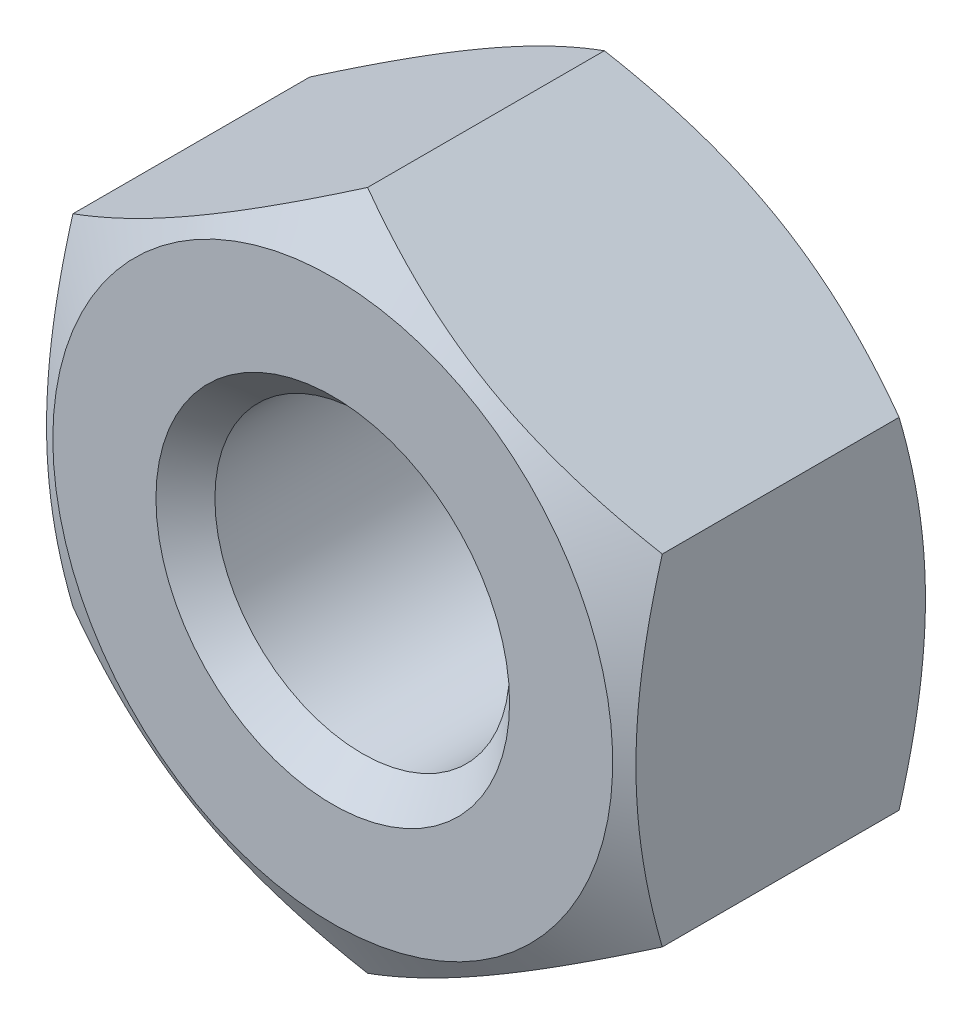
ISO-10303-21;
HEADER;
FILE_DESCRIPTION(('STEP AP214'),'2;1');
FILE_NAME('part.step','',(''),(''),'','','');
FILE_SCHEMA(('AUTOMOTIVE_DESIGN { 1 0 10303 214 1 1 1 1 }'));
ENDSEC;
DATA;
#1=APPLICATION_CONTEXT('core data for automotive mechanical design processes');
#2=APPLICATION_PROTOCOL_DEFINITION('international standard','automotive_design',2000,#1);
#3=PRODUCT_CONTEXT('',#1,'mechanical');
#4=PRODUCT('Part','Part','',(#3));
#5=PRODUCT_RELATED_PRODUCT_CATEGORY('part','',(#4));
#6=PRODUCT_DEFINITION_FORMATION('','',#4);
#7=PRODUCT_DEFINITION_CONTEXT('part definition',#1,'design');
#8=PRODUCT_DEFINITION('design','',#6,#7);
#9=PRODUCT_DEFINITION_SHAPE('','',#8);
#10=(LENGTH_UNIT() NAMED_UNIT(*) SI_UNIT(.MILLI.,.METRE.));
#11=(NAMED_UNIT(*) PLANE_ANGLE_UNIT() SI_UNIT($,.RADIAN.));
#12=(NAMED_UNIT(*) SI_UNIT($,.STERADIAN.) SOLID_ANGLE_UNIT());
#13=UNCERTAINTY_MEASURE_WITH_UNIT(LENGTH_MEASURE(1.E-05),#10,'distance_accuracy_value','');
#14=(GEOMETRIC_REPRESENTATION_CONTEXT(3) GLOBAL_UNCERTAINTY_ASSIGNED_CONTEXT((#13)) GLOBAL_UNIT_ASSIGNED_CONTEXT((#10,
#11,#12)) REPRESENTATION_CONTEXT('',''));
#15=CARTESIAN_POINT('',(0.,0.,0.));
#16=DIRECTION('',(0.,0.,1.));
#17=DIRECTION('',(1.,0.,0.));
#18=AXIS2_PLACEMENT_3D('',#15,#16,#17);
#19=CARTESIAN_POINT('',(0.,0.,0.));
#20=DIRECTION('',(0.,0.,1.));
#21=DIRECTION('',(1.,0.,0.));
#22=AXIS2_PLACEMENT_3D('',#19,#20,#21);
#23=PLANE('',#22);
#24=CARTESIAN_POINT('',(0.,0.,0.));
#25=DIRECTION('',(0.,0.,1.));
#26=DIRECTION('',(1.,0.,0.));
#27=AXIS2_PLACEMENT_3D('',#24,#25,#26);
#28=CIRCLE('',#27,3.);
#29=CARTESIAN_POINT('',(3.,0.,0.));
#30=VERTEX_POINT('',#29);
#31=EDGE_CURVE('E11',#30,#30,#28,.T.);
#32=ORIENTED_EDGE('',*,*,#31,.T.);
#33=EDGE_LOOP('',(#32));
#34=FACE_BOUND('',#33,.T.);
#35=CARTESIAN_POINT('',(0.,0.,0.));
#36=DIRECTION('',(0.,0.,-1.));
#37=DIRECTION('',(-1.,0.,0.));
#38=AXIS2_PLACEMENT_3D('',#35,#36,#37);
#39=CIRCLE('',#38,4.74999999999995);
#40=CARTESIAN_POINT('',(-4.74999999999995,0.,0.));
#41=VERTEX_POINT('',#40);
#42=EDGE_CURVE('E260',#41,#41,#39,.T.);
#43=ORIENTED_EDGE('',*,*,#42,.T.);
#44=EDGE_LOOP('',(#43));
#45=FACE_BOUND('',#44,.T.);
#46=ADVANCED_FACE('F46',(#34,#45),#23,.F.);
#47=CARTESIAN_POINT('',(0.,0.,5.2));
#48=DIRECTION('',(0.,0.,1.));
#49=DIRECTION('',(1.,0.,0.));
#50=AXIS2_PLACEMENT_3D('',#47,#48,#49);
#51=PLANE('',#50);
#52=CARTESIAN_POINT('',(0.,0.,5.2));
#53=DIRECTION('',(0.,0.,1.));
#54=DIRECTION('',(1.,0.,0.));
#55=AXIS2_PLACEMENT_3D('',#52,#53,#54);
#56=CIRCLE('',#55,3.);
#57=CARTESIAN_POINT('',(3.,0.,5.2));
#58=VERTEX_POINT('',#57);
#59=EDGE_CURVE('E55',#58,#58,#56,.F.);
#60=ORIENTED_EDGE('',*,*,#59,.T.);
#61=EDGE_LOOP('',(#60));
#62=FACE_BOUND('',#61,.T.);
#63=CARTESIAN_POINT('',(0.,0.,5.2));
#64=DIRECTION('',(0.,0.,-1.));
#65=DIRECTION('',(-1.,0.,0.));
#66=AXIS2_PLACEMENT_3D('',#63,#64,#65);
#67=CIRCLE('',#66,4.74999999999995);
#68=CARTESIAN_POINT('',(-4.74999999999995,0.,5.2));
#69=VERTEX_POINT('',#68);
#70=EDGE_CURVE('E262',#69,#69,#67,.T.);
#71=ORIENTED_EDGE('',*,*,#70,.F.);
#72=EDGE_LOOP('',(#71));
#73=FACE_BOUND('',#72,.T.);
#74=ADVANCED_FACE('F250',(#62,#73),#51,.T.);
#75=CARTESIAN_POINT('',(0.,0.,5.2));
#76=DIRECTION('',(0.,0.,-1.));
#77=DIRECTION('',(-1.,0.,0.));
#78=AXIS2_PLACEMENT_3D('',#75,#76,#77);
#79=CYLINDRICAL_SURFACE('',#78,2.5);
#80=CARTESIAN_POINT('',(0.,0.,4.7));
#81=DIRECTION('',(0.,0.,1.));
#82=DIRECTION('',(1.,0.,0.));
#83=AXIS2_PLACEMENT_3D('',#80,#81,#82);
#84=CIRCLE('',#83,2.5);
#85=CARTESIAN_POINT('',(2.5,0.,4.7));
#86=VERTEX_POINT('',#85);
#87=EDGE_CURVE('E271',#86,#86,#84,.T.);
#88=ORIENTED_EDGE('',*,*,#87,.T.);
#89=EDGE_LOOP('',(#88));
#90=FACE_BOUND('',#89,.T.);
#91=CARTESIAN_POINT('',(0.,0.,0.500000000000006));
#92=DIRECTION('',(0.,0.,1.));
#93=DIRECTION('',(1.,0.,0.));
#94=AXIS2_PLACEMENT_3D('',#91,#92,#93);
#95=CIRCLE('',#94,2.5);
#96=CARTESIAN_POINT('',(2.5,0.,0.500000000000006));
#97=VERTEX_POINT('',#96);
#98=EDGE_CURVE('E269',#97,#97,#95,.F.);
#99=ORIENTED_EDGE('',*,*,#98,.T.);
#100=EDGE_LOOP('',(#99));
#101=FACE_BOUND('',#100,.T.);
#102=ADVANCED_FACE('F153',(#90,#101),#79,.F.);
#103=CARTESIAN_POINT('',(0.,0.,5.2));
#104=DIRECTION('',(0.,0.,-1.));
#105=DIRECTION('',(-1.,0.,0.));
#106=AXIS2_PLACEMENT_3D('',#103,#104,#105);
#107=CONICAL_SURFACE('',#106,4.74999999999995,1.0471975511966);
#108=ORIENTED_EDGE('',*,*,#70,.T.);
#109=EDGE_LOOP('',(#108));
#110=FACE_BOUND('',#109,.T.);
#111=CARTESIAN_POINT('',(-5.00020000000001,2.88663587589428,4.60901377665075));
#112=CARTESIAN_POINT('',(-4.78046540547483,3.01349970319367,4.68227586506495));
#113=CARTESIAN_POINT('',(-4.55885141554043,3.14144859993848,4.74891111078449));
#114=CARTESIAN_POINT('',(-4.1117860045465,3.3995619353212,4.86522344169177));
#115=CARTESIAN_POINT('',(-3.88632664040924,3.52973095989717,4.91485938278679));
#116=CARTESIAN_POINT('',(-3.43816769477651,3.78847564779796,4.99211140728389));
#117=CARTESIAN_POINT('',(-3.21553790689583,3.91701101576051,5.0202420544191));
#118=CARTESIAN_POINT('',(-2.88081009815338,4.11026620624321,5.0454675107489));
#119=CARTESIAN_POINT('',(-2.76915780319496,4.17472868879309,5.05104897293311));
#120=CARTESIAN_POINT('',(-2.54575002932623,4.30371322717526,5.05646021595112));
#121=CARTESIAN_POINT('',(-2.43399455370971,4.36823528110587,5.05629017444439));
#122=CARTESIAN_POINT('',(-2.12781576914939,4.54500768479193,5.04790880091056));
#123=CARTESIAN_POINT('',(-1.93349391403281,4.65719946015292,5.03383266080534));
#124=CARTESIAN_POINT('',(-1.54613989800231,4.88083840557981,4.98919717559316));
#125=CARTESIAN_POINT('',(-1.35310909862844,4.9922847895602,4.95862257255509));
#126=CARTESIAN_POINT('',(-0.964974657525157,5.21637431361295,4.88219393908143));
#127=CARTESIAN_POINT('',(-0.769920001358273,5.32898917185759,4.83601605382392));
#128=CARTESIAN_POINT('',(-0.382719654641236,5.55253939626498,4.73121063821066));
#129=CARTESIAN_POINT('',(-0.190569004591916,5.66347762579592,4.67260772926522));
#130=CARTESIAN_POINT('',(0.000199999999999706,5.7736181619501,4.60901377665077));
#131=B_SPLINE_CURVE_WITH_KNOTS('',3,(#111,#112,#113,#114,#115,#116,#117,#118,#119,#120,#121,
#122,#123,#124,#125,#126,#127,#128,#129,#130),.UNSPECIFIED.,.F.,.F.,(4,2,2,2,2,2,2,2,2,4),(0.,
0.792555841363088,1.58701660053333,2.36181537487279,2.74884076077324,3.13585419177293,
3.80962362599678,4.48401723901189,5.17336882348929,5.86136694793727),.UNSPECIFIED.);
#132=CARTESIAN_POINT('',(-5.00000000000001,2.88675134594807,4.60908044531739));
#133=VERTEX_POINT('',#132);
#134=CARTESIAN_POINT('',(0.,5.77350269189626,4.60908044531739));
#135=VERTEX_POINT('',#134);
#136=EDGE_CURVE('E98',#133,#135,#131,.T.);
#137=ORIENTED_EDGE('',*,*,#136,.F.);
#138=CARTESIAN_POINT('',(-4.99999999999997,-8.69061564132567,2.15372364975125));
#139=CARTESIAN_POINT('',(-4.99999999999997,-8.48268394524598,2.25776403356811));
#140=CARTESIAN_POINT('',(-4.99999999999997,-8.27439007804498,2.36108817885115));
#141=CARTESIAN_POINT('',(-4.99999999999998,-7.85691284140685,2.56595776209098));
#142=CARTESIAN_POINT('',(-4.99999999999998,-7.64772941367701,2.66750308117799));
#143=CARTESIAN_POINT('',(-4.99999999999998,-7.22791382991098,2.86865689722291));
#144=CARTESIAN_POINT('',(-4.99999999999998,-7.01727960641612,2.96826108845748));
#145=CARTESIAN_POINT('',(-4.99999999999998,-6.59479076758856,3.16484081187025));
#146=CARTESIAN_POINT('',(-4.99999999999998,-6.38293617619383,3.2618163953981));
#147=CARTESIAN_POINT('',(-4.99999999999998,-5.94818443110869,3.45683242695515));
#148=CARTESIAN_POINT('',(-4.99999999999998,-5.725220135249,3.55472368627456));
#149=CARTESIAN_POINT('',(-4.99999999999998,-5.27739308280183,3.74605863921015));
#150=CARTESIAN_POINT('',(-4.99999999999998,-5.05253039252397,3.83950248742082));
#151=CARTESIAN_POINT('',(-4.99999999999999,-4.60065979540236,4.02069463566063));
#152=CARTESIAN_POINT('',(-4.99999999999999,-4.37365321091456,4.10844621344655));
#153=CARTESIAN_POINT('',(-4.99999999999999,-3.91698836638131,4.27672051248316));
#154=CARTESIAN_POINT('',(-4.99999999999999,-3.68733039965607,4.35724402488156));
#155=CARTESIAN_POINT('',(-4.99999999999999,-3.17092877234545,4.52678111374937));
#156=CARTESIAN_POINT('',(-4.99999999999999,-2.88338157519588,4.61338418358004));
#157=CARTESIAN_POINT('',(-4.99999999999999,-2.303099826238,4.76760888200547));
#158=CARTESIAN_POINT('',(-4.99999999999999,-2.01036573162984,4.83523217481491));
#159=CARTESIAN_POINT('',(-5.,-1.57029143198805,4.91768382294053));
#160=CARTESIAN_POINT('',(-5.,-1.42468959501621,4.94187517808081));
#161=CARTESIAN_POINT('',(-5.,-1.1325504449918,4.9836605695792));
#162=CARTESIAN_POINT('',(-5.,-0.986013270335832,5.0012555599589));
#163=CARTESIAN_POINT('',(-5.,-0.692295876516685,5.02932221397903));
#164=CARTESIAN_POINT('',(-5.,-0.545115856439701,5.03979594463513));
#165=CARTESIAN_POINT('',(-5.,-0.250411346256412,5.05328853796119));
#166=CARTESIAN_POINT('',(-5.,-0.102886857644068,5.05630743290291));
#167=CARTESIAN_POINT('',(-5.,0.193019060250051,5.05478294605597));
#168=CARTESIAN_POINT('',(-5.,0.341400251748504,5.05019351840398));
#169=CARTESIAN_POINT('',(-5.,0.637736941020561,5.03352179950159));
#170=CARTESIAN_POINT('',(-5.,0.785692436900443,5.02143947497036));
#171=CARTESIAN_POINT('',(-5.,1.08090091836985,4.99016719608272));
#172=CARTESIAN_POINT('',(-5.00000000000001,1.22815361672014,4.97097455197614));
#173=CARTESIAN_POINT('',(-5.00000000000001,1.52164945065428,4.92604826267297));
#174=CARTESIAN_POINT('',(-5.00000000000001,1.66789255074374,4.9003143886974));
#175=CARTESIAN_POINT('',(-5.00000000000001,2.10979855298443,4.81331852826057));
#176=CARTESIAN_POINT('',(-5.00000000000001,2.40365859496364,4.74282778604577));
#177=CARTESIAN_POINT('',(-5.00000000000001,2.9862964906617,4.58324949480228));
#178=CARTESIAN_POINT('',(-5.00000000000001,3.27507137300197,4.49415144010025));
#179=CARTESIAN_POINT('',(-5.00000000000001,3.7877302866958,4.32242058539984));
#180=CARTESIAN_POINT('',(-5.00000000000001,4.01249142479451,4.24236753478509));
#181=CARTESIAN_POINT('',(-5.00000000000002,4.45943275354109,4.07556943938171));
#182=CARTESIAN_POINT('',(-5.00000000000002,4.68161363667019,3.98882624017314));
#183=CARTESIAN_POINT('',(-5.00000000000002,5.1239861476852,3.81000957946997));
#184=CARTESIAN_POINT('',(-5.00000000000002,5.34417629616972,3.71793247904404));
#185=CARTESIAN_POINT('',(-5.00000000000002,5.78276269152037,3.52959667278662));
#186=CARTESIAN_POINT('',(-5.00000000000002,6.00115888105749,3.43333783393396));
#187=CARTESIAN_POINT('',(-5.00000000000002,6.42721369366357,3.24163249772081));
#188=CARTESIAN_POINT('',(-5.00000000000002,6.63493490413622,3.14632466543224));
#189=CARTESIAN_POINT('',(-5.00000000000002,7.04920736504243,2.95321206597292));
#190=CARTESIAN_POINT('',(-5.00000000000002,7.25575863359815,2.85540733760851));
#191=CARTESIAN_POINT('',(-5.00000000000003,7.66750718381997,2.65792301637888));
#192=CARTESIAN_POINT('',(-5.00000000000003,7.87270622505508,2.55824708473829));
#193=CARTESIAN_POINT('',(-5.00000000000003,8.28225837307034,2.35718545497377));
#194=CARTESIAN_POINT('',(-5.00000000000003,8.4866115033806,2.25579980481133));
#195=CARTESIAN_POINT('',(-5.00000000000003,8.69061564132564,2.1537236497513));
#196=B_SPLINE_CURVE_WITH_KNOTS('',3,(#138,#139,#140,#141,#142,#143,#144,#145,#146,#147,#148,
#149,#150,#151,#152,#153,#154,#155,#156,#157,#158,#159,#160,#161,#162,#163,#164,#165,#166,#167,
#168,#169,#170,#171,#172,#173,#174,#175,#176,#177,#178,#179,#180,#181,#182,#183,#184,#185,#186,
#187,#188,#189,#190,#191,#192,#193,#194,#195),.UNSPECIFIED.,.F.,.F.,(4,2,2,2,2,2,2,2,2,2,2,2,2,
2,2,2,2,2,2,2,2,2,2,2,2,2,2,2,4),(0.,0.697527813520904,1.39510206277623,2.0940791673033,
2.79304260750799,3.52352609535638,4.25398417261918,4.98401782938304,5.71397148264621,
6.61443482372739,7.51481918428095,7.95748671810436,8.40009020491592,8.84256516680505,
9.28503821323026,9.73019891179952,10.1753615876305,10.6206928354997,11.0660396609354,
11.9717186019101,12.8779102776224,13.5935610029193,14.3090150063245,15.0249629955038,
15.7409337757001,16.4265417399307,17.1121390550339,17.7965116653879,18.480865109365),.UNSPECIFIED.);
#197=CARTESIAN_POINT('',(-4.99999999999986,-2.88675134594823,4.60908044531739));
#198=VERTEX_POINT('',#197);
#199=EDGE_CURVE('E101',#198,#133,#196,.T.);
#200=ORIENTED_EDGE('',*,*,#199,.F.);
#201=CARTESIAN_POINT('',(0.000200000000040316,-5.7736181619501,4.60901377665071));
#202=CARTESIAN_POINT('',(-0.219534594525147,-5.64675433465071,4.6822758650649));
#203=CARTESIAN_POINT('',(-0.441148584459545,-5.5188054379059,4.74891111078445));
#204=CARTESIAN_POINT('',(-0.888213995453484,-5.26069210252318,4.86522344169173));
#205=CARTESIAN_POINT('',(-1.11367335959075,-5.13052307794722,4.91485938278675));
#206=CARTESIAN_POINT('',(-1.56183230522349,-4.87177839004642,4.99211140728384));
#207=CARTESIAN_POINT('',(-1.78446209310417,-4.74324302208387,5.02024205441905));
#208=CARTESIAN_POINT('',(-2.11918990184663,-4.54998783160117,5.04546751074885));
#209=CARTESIAN_POINT('',(-2.23084219680505,-4.48552534905129,5.05104897293305));
#210=CARTESIAN_POINT('',(-2.45424997067379,-4.35654081066912,5.05646021595107));
#211=CARTESIAN_POINT('',(-2.56600544629031,-4.29201875673851,5.05629017444434));
#212=CARTESIAN_POINT('',(-2.87218423085063,-4.11524635305245,5.0479088009105));
#213=CARTESIAN_POINT('',(-3.06650608596721,-4.00305457769147,5.03383266080529));
#214=CARTESIAN_POINT('',(-3.4538601019977,-3.77941563226459,4.98919717559311));
#215=CARTESIAN_POINT('',(-3.64689090137156,-3.6679692482842,4.95862257255503));
#216=CARTESIAN_POINT('',(-4.03502534247485,-3.44387972423146,4.88219393908138));
#217=CARTESIAN_POINT('',(-4.23007999864173,-3.33126486598682,4.83601605382387));
#218=CARTESIAN_POINT('',(-4.61728034535876,-3.10771464157943,4.73121063821061));
#219=CARTESIAN_POINT('',(-4.80943099540808,-2.99677641204849,4.67260772926517));
#220=CARTESIAN_POINT('',(-5.00019999999999,-2.88663587589432,4.60901377665072));
#221=B_SPLINE_CURVE_WITH_KNOTS('',3,(#201,#202,#203,#204,#205,#206,#207,#208,#209,#210,#211,
#212,#213,#214,#215,#216,#217,#218,#219,#220),.UNSPECIFIED.,.F.,.F.,(4,2,2,2,2,2,2,2,2,4),(0.,
0.792555841363098,1.58701660053335,2.36181537487283,2.74884076077328,3.13585419177298,
3.80962362599682,4.48401723901191,5.1733688234893,5.86136694793727),.UNSPECIFIED.);
#222=CARTESIAN_POINT('',(2.21177243187043E-13,-5.77350269189616,4.60908044531739));
#223=VERTEX_POINT('',#222);
#224=EDGE_CURVE('E118',#223,#198,#221,.T.);
#225=ORIENTED_EDGE('',*,*,#224,.F.);
#226=CARTESIAN_POINT('',(5.00020000000003,-2.88663587589425,4.60901377665072));
#227=CARTESIAN_POINT('',(4.78046540547485,-3.01349970319364,4.68227586506492));
#228=CARTESIAN_POINT('',(4.55885141554045,-3.14144859993845,4.74891111078446));
#229=CARTESIAN_POINT('',(4.11178600454652,-3.39956193532117,4.86522344169174));
#230=CARTESIAN_POINT('',(3.88632664040926,-3.52973095989714,4.91485938278676));
#231=CARTESIAN_POINT('',(3.43816769477652,-3.78847564779795,4.99211140728385));
#232=CARTESIAN_POINT('',(3.21553790689584,-3.91701101576049,5.02024205441905));
#233=CARTESIAN_POINT('',(2.88081009815339,-4.1102662062432,5.04546751074886));
#234=CARTESIAN_POINT('',(2.76915780319497,-4.17472868879309,5.05104897293306));
#235=CARTESIAN_POINT('',(2.54575002932623,-4.30371322717526,5.05646021595107));
#236=CARTESIAN_POINT('',(2.43399455370972,-4.36823528110587,5.05629017444434));
#237=CARTESIAN_POINT('',(2.12781576914939,-4.54500768479193,5.0479088009105));
#238=CARTESIAN_POINT('',(1.93349391403282,-4.65719946015291,5.03383266080528));
#239=CARTESIAN_POINT('',(1.54613989800233,-4.8808384055798,4.9891971755931));
#240=CARTESIAN_POINT('',(1.35310909862846,-4.9922847895602,4.95862257255503));
#241=CARTESIAN_POINT('',(0.964974657525182,-5.21637431361294,4.88219393908137));
#242=CARTESIAN_POINT('',(0.769920001358301,-5.32898917185759,4.83601605382386));
#243=CARTESIAN_POINT('',(0.38271965464127,-5.55253939626498,4.7312106382106));
#244=CARTESIAN_POINT('',(0.190569004591952,-5.66347762579592,4.67260772926516));
#245=CARTESIAN_POINT('',(-0.000199999999959717,-5.7736181619501,4.60901377665071));
#246=B_SPLINE_CURVE_WITH_KNOTS('',3,(#226,#227,#228,#229,#230,#231,#232,#233,#234,#235,#236,
#237,#238,#239,#240,#241,#242,#243,#244,#245),.UNSPECIFIED.,.F.,.F.,(4,2,2,2,2,2,2,2,2,4),(0.,
0.792555841363093,1.58701660053334,2.36181537487282,2.74884076077326,3.13585419177296,
3.8096236259968,4.48401723901191,5.1733688234893,5.86136694793727),.UNSPECIFIED.);
#247=CARTESIAN_POINT('',(5.00000000000003,-2.88675134594808,4.60908044531739));
#248=VERTEX_POINT('',#247);
#249=EDGE_CURVE('E62',#248,#223,#246,.T.);
#250=ORIENTED_EDGE('',*,*,#249,.F.);
#251=CARTESIAN_POINT('',(4.99999999999991,8.69061564132571,2.1537236497513));
#252=CARTESIAN_POINT('',(4.99999999999991,8.48268394524602,2.25776403356816));
#253=CARTESIAN_POINT('',(4.99999999999991,8.27439007804502,2.36108817885119));
#254=CARTESIAN_POINT('',(4.99999999999992,7.8569128414069,2.56595776209103));
#255=CARTESIAN_POINT('',(4.99999999999992,7.64772941367706,2.66750308117803));
#256=CARTESIAN_POINT('',(4.99999999999993,7.22791382991103,2.86865689722295));
#257=CARTESIAN_POINT('',(4.99999999999993,7.01727960641617,2.96826108845753));
#258=CARTESIAN_POINT('',(4.99999999999993,6.59479076758862,3.16484081187029));
#259=CARTESIAN_POINT('',(4.99999999999993,6.38293617619389,3.26181639539814));
#260=CARTESIAN_POINT('',(4.99999999999994,5.94818443110875,3.45683242695518));
#261=CARTESIAN_POINT('',(4.99999999999994,5.72522013524907,3.55472368627459));
#262=CARTESIAN_POINT('',(4.99999999999995,5.2773930828019,3.74605863921018));
#263=CARTESIAN_POINT('',(4.99999999999995,5.05253039252404,3.83950248742084));
#264=CARTESIAN_POINT('',(4.99999999999995,4.60065979540244,4.02069463566065));
#265=CARTESIAN_POINT('',(4.99999999999995,4.37365321091463,4.10844621344658));
#266=CARTESIAN_POINT('',(4.99999999999996,3.91698836638139,4.27672051248318));
#267=CARTESIAN_POINT('',(4.99999999999996,3.68733039965615,4.35724402488159));
#268=CARTESIAN_POINT('',(4.99999999999997,3.17092877234553,4.52678111374939));
#269=CARTESIAN_POINT('',(4.99999999999997,2.88338157519596,4.61338418358005));
#270=CARTESIAN_POINT('',(4.99999999999998,2.30309982623808,4.76760888200548));
#271=CARTESIAN_POINT('',(4.99999999999998,2.01036573162993,4.83523217481492));
#272=CARTESIAN_POINT('',(4.99999999999998,1.57029143198814,4.91768382294054));
#273=CARTESIAN_POINT('',(4.99999999999999,1.4246895950163,4.94187517808081));
#274=CARTESIAN_POINT('',(4.99999999999999,1.13255044499189,4.9836605695792));
#275=CARTESIAN_POINT('',(4.99999999999999,0.986013270335923,5.00125555995891));
#276=CARTESIAN_POINT('',(4.99999999999999,0.692295876516778,5.02932221397904));
#277=CARTESIAN_POINT('',(4.99999999999999,0.545115856439795,5.03979594463513));
#278=CARTESIAN_POINT('',(5.,0.250411346256507,5.05328853796119));
#279=CARTESIAN_POINT('',(5.,0.102886857644165,5.05630743290291));
#280=CARTESIAN_POINT('',(5.,-0.193019060249953,5.05478294605597));
#281=CARTESIAN_POINT('',(5.,-0.341400251748405,5.05019351840398));
#282=CARTESIAN_POINT('',(5.00000000000001,-0.637736941020461,5.03352179950158));
#283=CARTESIAN_POINT('',(5.00000000000001,-0.785692436900342,5.02143947497035));
#284=CARTESIAN_POINT('',(5.00000000000001,-1.08090091836975,4.99016719608272));
#285=CARTESIAN_POINT('',(5.00000000000001,-1.22815361672003,4.97097455197614));
#286=CARTESIAN_POINT('',(5.00000000000002,-1.52164945065418,4.92604826267296));
#287=CARTESIAN_POINT('',(5.00000000000002,-1.66789255074363,4.9003143886974));
#288=CARTESIAN_POINT('',(5.00000000000002,-2.10979855298432,4.81331852826056));
#289=CARTESIAN_POINT('',(5.00000000000002,-2.40365859496353,4.74282778604577));
#290=CARTESIAN_POINT('',(5.00000000000003,-2.98629649066159,4.58324949480227));
#291=CARTESIAN_POINT('',(5.00000000000003,-3.27507137300186,4.49415144010024));
#292=CARTESIAN_POINT('',(5.00000000000004,-3.78773028669569,4.32242058539983));
#293=CARTESIAN_POINT('',(5.00000000000004,-4.0124914247944,4.24236753478507));
#294=CARTESIAN_POINT('',(5.00000000000005,-4.45943275354099,4.0755694393817));
#295=CARTESIAN_POINT('',(5.00000000000005,-4.68161363667009,3.98882624017312));
#296=CARTESIAN_POINT('',(5.00000000000005,-5.12398614768512,3.81000957946995));
#297=CARTESIAN_POINT('',(5.00000000000006,-5.34417629616963,3.71793247904401));
#298=CARTESIAN_POINT('',(5.00000000000006,-5.78276269152029,3.52959667278659));
#299=CARTESIAN_POINT('',(5.00000000000006,-6.00115888105742,3.43333783393393));
#300=CARTESIAN_POINT('',(5.00000000000007,-6.42721369366351,3.24163249772078));
#301=CARTESIAN_POINT('',(5.00000000000007,-6.63493490413615,3.1463246654322));
#302=CARTESIAN_POINT('',(5.00000000000007,-7.04920736504237,2.95321206597288));
#303=CARTESIAN_POINT('',(5.00000000000008,-7.2557586335981,2.85540733760847));
#304=CARTESIAN_POINT('',(5.00000000000008,-7.66750718381992,2.65792301637884));
#305=CARTESIAN_POINT('',(5.00000000000008,-7.87270622505503,2.55824708473825));
#306=CARTESIAN_POINT('',(5.00000000000009,-8.2822583730703,2.35718545497372));
#307=CARTESIAN_POINT('',(5.00000000000009,-8.48661150338056,2.25579980481128));
#308=CARTESIAN_POINT('',(5.00000000000009,-8.6906156413256,2.15372364975125));
#309=B_SPLINE_CURVE_WITH_KNOTS('',3,(#251,#252,#253,#254,#255,#256,#257,#258,#259,#260,#261,
#262,#263,#264,#265,#266,#267,#268,#269,#270,#271,#272,#273,#274,#275,#276,#277,#278,#279,#280,
#281,#282,#283,#284,#285,#286,#287,#288,#289,#290,#291,#292,#293,#294,#295,#296,#297,#298,#299,
#300,#301,#302,#303,#304,#305,#306,#307,#308),.UNSPECIFIED.,.F.,.F.,(4,2,2,2,2,2,2,2,2,2,2,2,2,
2,2,2,2,2,2,2,2,2,2,2,2,2,2,2,4),(0.,0.697527813520898,1.39510206277622,2.09407916730328,
2.79304260750796,3.52352609535635,4.25398417261915,4.98401782938299,5.71397148264615,
6.61443482372734,7.51481918428089,7.9574867181043,8.40009020491586,8.84256516680498,
9.28503821323019,9.73019891179945,10.1753615876304,10.6206928354996,11.0660396609353,
11.9717186019101,12.8779102776223,13.5935610029192,14.3090150063245,15.0249629955037,
15.7409337757,16.4265417399307,17.1121390550339,17.7965116653879,18.480865109365),.UNSPECIFIED.);
#310=CARTESIAN_POINT('',(4.99999999999997,2.88675134594814,4.60908044531739));
#311=VERTEX_POINT('',#310);
#312=EDGE_CURVE('E125',#311,#248,#309,.T.);
#313=ORIENTED_EDGE('',*,*,#312,.F.);
#314=CARTESIAN_POINT('',(-0.0002,5.7736181619501,4.60901377665077));
#315=CARTESIAN_POINT('',(0.219534594525184,5.64675433465072,4.68227586506496));
#316=CARTESIAN_POINT('',(0.441148584459579,5.51880543790591,4.7489111107845));
#317=CARTESIAN_POINT('',(0.888213995453509,5.26069210252319,4.86522344169178));
#318=CARTESIAN_POINT('',(1.11367335959077,5.13052307794723,4.9148593827868));
#319=CARTESIAN_POINT('',(1.5618323052235,4.87177839004643,4.99211140728389));
#320=CARTESIAN_POINT('',(1.78446209310418,4.74324302208389,5.02024205441909));
#321=CARTESIAN_POINT('',(2.11918990184663,4.54998783160119,5.0454675107489));
#322=CARTESIAN_POINT('',(2.23084219680505,4.48552534905131,5.0510489729331));
#323=CARTESIAN_POINT('',(2.45424997067379,4.35654081066914,5.05646021595111));
#324=CARTESIAN_POINT('',(2.5660054462903,4.29201875673853,5.05629017444438));
#325=CARTESIAN_POINT('',(2.87218423085063,4.11524635305248,5.04790880091054));
#326=CARTESIAN_POINT('',(3.0665060859672,4.0030545776915,5.03383266080532));
#327=CARTESIAN_POINT('',(3.45386010199769,3.77941563226462,4.98919717559315));
#328=CARTESIAN_POINT('',(3.64689090137155,3.66796924828423,4.95862257255507));
#329=CARTESIAN_POINT('',(4.03502534247483,3.44387972423149,4.88219393908141));
#330=CARTESIAN_POINT('',(4.23007999864171,3.33126486598685,4.8360160538239));
#331=CARTESIAN_POINT('',(4.61728034535874,3.10771464157946,4.73121063821064));
#332=CARTESIAN_POINT('',(4.80943099540806,2.99677641204853,4.67260772926521));
#333=CARTESIAN_POINT('',(5.00019999999997,2.88663587589435,4.60901377665075));
#334=B_SPLINE_CURVE_WITH_KNOTS('',3,(#314,#315,#316,#317,#318,#319,#320,#321,#322,#323,#324,
#325,#326,#327,#328,#329,#330,#331,#332,#333),.UNSPECIFIED.,.F.,.F.,(4,2,2,2,2,2,2,2,2,4),(0.,
0.792555841363083,1.58701660053332,2.36181537487278,2.74884076077323,3.13585419177292,
3.80962362599676,4.48401723901185,5.17336882348924,5.86136694793719),.UNSPECIFIED.);
#335=EDGE_CURVE('E104',#135,#311,#334,.T.);
#336=ORIENTED_EDGE('',*,*,#335,.F.);
#337=EDGE_LOOP('',(#137,#200,#225,#250,#313,#336));
#338=FACE_BOUND('',#337,.T.);
#339=ADVANCED_FACE('F100',(#110,#338),#107,.T.);
#340=CARTESIAN_POINT('',(0.,0.,0.590919554682606));
#341=DIRECTION('',(0.,0.,1.));
#342=DIRECTION('',(1.,0.,0.));
#343=AXIS2_PLACEMENT_3D('',#340,#341,#342);
#344=CONICAL_SURFACE('',#343,5.77350269189621,1.0471975511966);
#345=ORIENTED_EDGE('',*,*,#42,.F.);
#346=EDGE_LOOP('',(#345));
#347=FACE_BOUND('',#346,.T.);
#348=CARTESIAN_POINT('',(5.00000000000009,-8.6906156413256,3.04627635024875));
#349=CARTESIAN_POINT('',(5.00000000000009,-8.48268394524591,2.94223596643189));
#350=CARTESIAN_POINT('',(5.00000000000009,-8.27439007804491,2.83891182114885));
#351=CARTESIAN_POINT('',(5.00000000000008,-7.85691284140678,2.63404223790901));
#352=CARTESIAN_POINT('',(5.00000000000008,-7.64772941367694,2.53249691882201));
#353=CARTESIAN_POINT('',(5.00000000000008,-7.22791382991091,2.33134310277709));
#354=CARTESIAN_POINT('',(5.00000000000007,-7.01727960641605,2.23173891154251));
#355=CARTESIAN_POINT('',(5.00000000000007,-6.59479076758849,2.03515918812974));
#356=CARTESIAN_POINT('',(5.00000000000007,-6.38293617619376,1.93818360460189));
#357=CARTESIAN_POINT('',(5.00000000000006,-5.94818443110862,1.74316757304484));
#358=CARTESIAN_POINT('',(5.00000000000006,-5.72522013524893,1.64527631372543));
#359=CARTESIAN_POINT('',(5.00000000000006,-5.27739308280175,1.45394136078984));
#360=CARTESIAN_POINT('',(5.00000000000005,-5.0525303925239,1.36049751257918));
#361=CARTESIAN_POINT('',(5.00000000000005,-4.60065979540229,1.17930536433937));
#362=CARTESIAN_POINT('',(5.00000000000005,-4.37365321091448,1.09155378655344));
#363=CARTESIAN_POINT('',(5.00000000000004,-3.91698836638124,0.923279487516834));
#364=CARTESIAN_POINT('',(5.00000000000004,-3.68733039965599,0.842755975118429));
#365=CARTESIAN_POINT('',(5.00000000000003,-3.17092877234537,0.673218886250626));
#366=CARTESIAN_POINT('',(5.00000000000003,-2.8833815751958,0.586615816419957));
#367=CARTESIAN_POINT('',(5.00000000000002,-2.30309982623792,0.432391117994524));
#368=CARTESIAN_POINT('',(5.00000000000002,-2.01036573162976,0.364767825185088));
#369=CARTESIAN_POINT('',(5.00000000000002,-1.57029143198797,0.282316177059467));
#370=CARTESIAN_POINT('',(5.00000000000002,-1.42468959501613,0.258124821919192));
#371=CARTESIAN_POINT('',(5.00000000000001,-1.13255044499172,0.216339430420799));
#372=CARTESIAN_POINT('',(5.00000000000001,-0.98601327033575,0.198744440041095));
#373=CARTESIAN_POINT('',(5.00000000000001,-0.692295876516603,0.170677786020966));
#374=CARTESIAN_POINT('',(5.00000000000001,-0.545115856439617,0.160204055364868));
#375=CARTESIAN_POINT('',(5.,-0.250411346256329,0.146711462038807));
#376=CARTESIAN_POINT('',(5.,-0.102886857643986,0.143692567097088));
#377=CARTESIAN_POINT('',(5.,0.193019060250133,0.145217053944029));
#378=CARTESIAN_POINT('',(5.,0.341400251748585,0.149806481596014));
#379=CARTESIAN_POINT('',(4.99999999999999,0.637736941020642,0.166478200498413));
#380=CARTESIAN_POINT('',(4.99999999999999,0.785692436900524,0.178560525029642));
#381=CARTESIAN_POINT('',(4.99999999999999,1.08090091836993,0.20983280391728));
#382=CARTESIAN_POINT('',(4.99999999999999,1.22815361672022,0.229025448023858));
#383=CARTESIAN_POINT('',(4.99999999999998,1.52164945065437,0.273951737327035));
#384=CARTESIAN_POINT('',(4.99999999999998,1.66789255074382,0.299685611302598));
#385=CARTESIAN_POINT('',(4.99999999999998,2.10979855298451,0.386681471739433));
#386=CARTESIAN_POINT('',(4.99999999999998,2.40365859496373,0.457172213954228));
#387=CARTESIAN_POINT('',(4.99999999999997,2.98629649066179,0.616750505197728));
#388=CARTESIAN_POINT('',(4.99999999999997,3.27507137300206,0.705848559899753));
#389=CARTESIAN_POINT('',(4.99999999999996,3.78773028669589,0.877579414600163));
#390=CARTESIAN_POINT('',(4.99999999999996,4.0124914247946,0.957632465214917));
#391=CARTESIAN_POINT('',(4.99999999999995,4.45943275354118,1.12443056061829));
#392=CARTESIAN_POINT('',(4.99999999999995,4.68161363667027,1.21117375982687));
#393=CARTESIAN_POINT('',(4.99999999999995,5.12398614768529,1.38999042053004));
#394=CARTESIAN_POINT('',(4.99999999999995,5.3441762961698,1.48206752095596));
#395=CARTESIAN_POINT('',(4.99999999999994,5.78276269152045,1.67040332721338));
#396=CARTESIAN_POINT('',(4.99999999999994,6.00115888105757,1.76666216606605));
#397=CARTESIAN_POINT('',(4.99999999999993,6.42721369366365,1.95836750227919));
#398=CARTESIAN_POINT('',(4.99999999999993,6.6349349041363,2.05367533456776));
#399=CARTESIAN_POINT('',(4.99999999999993,7.04920736504251,2.24678793402708));
#400=CARTESIAN_POINT('',(4.99999999999993,7.25575863359823,2.34459266239149));
#401=CARTESIAN_POINT('',(4.99999999999992,7.66750718382005,2.54207698362112));
#402=CARTESIAN_POINT('',(4.99999999999992,7.87270622505515,2.64175291526171));
#403=CARTESIAN_POINT('',(4.99999999999991,8.28225837307042,2.84281454502623));
#404=CARTESIAN_POINT('',(4.99999999999991,8.48661150338067,2.94420019518866));
#405=CARTESIAN_POINT('',(4.99999999999991,8.69061564132571,3.0462763502487));
#406=B_SPLINE_CURVE_WITH_KNOTS('',3,(#348,#349,#350,#351,#352,#353,#354,#355,#356,#357,#358,
#359,#360,#361,#362,#363,#364,#365,#366,#367,#368,#369,#370,#371,#372,#373,#374,#375,#376,#377,
#378,#379,#380,#381,#382,#383,#384,#385,#386,#387,#388,#389,#390,#391,#392,#393,#394,#395,#396,
#397,#398,#399,#400,#401,#402,#403,#404,#405),.UNSPECIFIED.,.F.,.F.,(4,2,2,2,2,2,2,2,2,2,2,2,2,
2,2,2,2,2,2,2,2,2,2,2,2,2,2,2,4),(0.,0.697527813520906,1.39510206277624,2.09407916730331,
2.793042607508,3.52352609535639,4.2539841726192,4.98401782938305,5.71397148264622,
6.61443482372741,7.51481918428097,7.95748671810437,8.40009020491594,8.84256516680507,
9.28503821323027,9.73019891179954,10.1753615876305,10.6206928354997,11.0660396609354,
11.9717186019102,12.8779102776225,13.5935610029193,14.3090150063245,15.0249629955038,
15.7409337757001,16.4265417399307,17.1121390550339,17.7965116653879,18.480865109365),.UNSPECIFIED.);
#407=CARTESIAN_POINT('',(5.00000000000003,-2.88675134594793,0.590919554682606));
#408=VERTEX_POINT('',#407);
#409=CARTESIAN_POINT('',(4.99999999999997,2.88675134594819,0.59091955468262));
#410=VERTEX_POINT('',#409);
#411=EDGE_CURVE('E138',#408,#410,#406,.T.);
#412=ORIENTED_EDGE('',*,*,#411,.F.);
#413=CARTESIAN_POINT('',(-0.000199999999959731,-5.7736181619501,0.590986223349291));
#414=CARTESIAN_POINT('',(0.219534594525226,-5.64675433465071,0.517724134935097));
#415=CARTESIAN_POINT('',(0.441148584459623,-5.5188054379059,0.451088889215554));
#416=CARTESIAN_POINT('',(0.888213995453557,-5.26069210252317,0.334776558308272));
#417=CARTESIAN_POINT('',(1.11367335959082,-5.1305230779472,0.28514061721325));
#418=CARTESIAN_POINT('',(1.56183230522356,-4.8717783900464,0.207888592716159));
#419=CARTESIAN_POINT('',(1.78446209310424,-4.74324302208385,0.17975794558095));
#420=CARTESIAN_POINT('',(2.11918990184669,-4.54998783160114,0.154532489251145));
#421=CARTESIAN_POINT('',(2.23084219680511,-4.48552534905125,0.148951027066945));
#422=CARTESIAN_POINT('',(2.45424997067385,-4.35654081066908,0.143539784048931));
#423=CARTESIAN_POINT('',(2.56600544629036,-4.29201875673847,0.143709825555664));
#424=CARTESIAN_POINT('',(2.87218423085069,-4.11524635305241,0.152091199089496));
#425=CARTESIAN_POINT('',(3.06650608596726,-4.00305457769143,0.166167339194711));
#426=CARTESIAN_POINT('',(3.45386010199775,-3.77941563226454,0.210802824406889));
#427=CARTESIAN_POINT('',(3.64689090137161,-3.66796924828415,0.241377427444965));
#428=CARTESIAN_POINT('',(4.03502534247489,-3.4438797242314,0.317806060918619));
#429=CARTESIAN_POINT('',(4.23007999864177,-3.33126486598676,0.363983946176134));
#430=CARTESIAN_POINT('',(4.6172803453588,-3.10771464157936,0.468789361789385));
#431=CARTESIAN_POINT('',(4.80943099540812,-2.99677641204843,0.527392270734823));
#432=CARTESIAN_POINT('',(5.00020000000003,-2.88663587589425,0.590986223349276));
#433=B_SPLINE_CURVE_WITH_KNOTS('',3,(#413,#414,#415,#416,#417,#418,#419,#420,#421,#422,#423,
#424,#425,#426,#427,#428,#429,#430,#431,#432),.UNSPECIFIED.,.F.,.F.,(4,2,2,2,2,2,2,2,2,4),(0.,
0.792555841363098,1.58701660053335,2.36181537487282,2.74884076077328,3.13585419177298,
3.80962362599682,4.48401723901191,5.17336882348931,5.86136694793726),.UNSPECIFIED.);
#434=CARTESIAN_POINT('',(2.18575157973078E-13,-5.77350269189616,0.590919554682606));
#435=VERTEX_POINT('',#434);
#436=EDGE_CURVE('E226',#435,#408,#433,.T.);
#437=ORIENTED_EDGE('',*,*,#436,.F.);
#438=CARTESIAN_POINT('',(-5.00019999999999,-2.88663587589432,0.590986223349276));
#439=CARTESIAN_POINT('',(-4.7804654054748,-3.0134997031937,0.517724134935083));
#440=CARTESIAN_POINT('',(-4.55885141554041,-3.14144859993851,0.451088889215542));
#441=CARTESIAN_POINT('',(-4.11178600454647,-3.39956193532123,0.334776558308263));
#442=CARTESIAN_POINT('',(-3.88632664040921,-3.5297309598972,0.285140617213242));
#443=CARTESIAN_POINT('',(-3.43816769477647,-3.788475647798,0.207888592716154));
#444=CARTESIAN_POINT('',(-3.21553790689578,-3.91701101576054,0.179757945580946));
#445=CARTESIAN_POINT('',(-2.88081009815333,-4.11026620624324,0.154532489251143));
#446=CARTESIAN_POINT('',(-2.76915780319491,-4.17472868879313,0.148951027066943));
#447=CARTESIAN_POINT('',(-2.54575002932617,-4.3037132271753,0.14353978404893));
#448=CARTESIAN_POINT('',(-2.43399455370966,-4.36823528110591,0.143709825555664));
#449=CARTESIAN_POINT('',(-2.12781576914933,-4.54500768479196,0.152091199089499));
#450=CARTESIAN_POINT('',(-1.93349391403275,-4.65719946015294,0.166167339194715));
#451=CARTESIAN_POINT('',(-1.54613989800226,-4.88083840557983,0.210802824406895));
#452=CARTESIAN_POINT('',(-1.35310909862839,-4.99228478956021,0.241377427444972));
#453=CARTESIAN_POINT('',(-0.964974657525109,-5.21637431361296,0.317806060918628));
#454=CARTESIAN_POINT('',(-0.769920001358226,-5.3289891718576,0.363983946176144));
#455=CARTESIAN_POINT('',(-0.382719654641193,-5.55253939626499,0.468789361789398));
#456=CARTESIAN_POINT('',(-0.190569004591874,-5.66347762579592,0.527392270734838));
#457=CARTESIAN_POINT('',(0.000200000000040183,-5.7736181619501,0.590986223349291));
#458=B_SPLINE_CURVE_WITH_KNOTS('',3,(#438,#439,#440,#441,#442,#443,#444,#445,#446,#447,#448,
#449,#450,#451,#452,#453,#454,#455,#456,#457),.UNSPECIFIED.,.F.,.F.,(4,2,2,2,2,2,2,2,2,4),(0.,
0.792555841363095,1.58701660053334,2.36181537487281,2.74884076077327,3.13585419177296,
3.80962362599681,4.48401723901191,5.1733688234893,5.86136694793727),.UNSPECIFIED.);
#459=CARTESIAN_POINT('',(-4.99999999999986,-2.88675134594823,0.590919554682606));
#460=VERTEX_POINT('',#459);
#461=EDGE_CURVE('E230',#460,#435,#458,.T.);
#462=ORIENTED_EDGE('',*,*,#461,.F.);
#463=CARTESIAN_POINT('',(-5.00000000000003,8.69061564132564,3.04627635024869));
#464=CARTESIAN_POINT('',(-5.00000000000003,8.48268394524594,2.94223596643183));
#465=CARTESIAN_POINT('',(-5.00000000000003,8.27439007804495,2.8389118211488));
#466=CARTESIAN_POINT('',(-5.00000000000003,7.85691284140682,2.63404223790896));
#467=CARTESIAN_POINT('',(-5.00000000000003,7.64772941367699,2.53249691882196));
#468=CARTESIAN_POINT('',(-5.00000000000002,7.22791382991095,2.33134310277704));
#469=CARTESIAN_POINT('',(-5.00000000000002,7.0172796064161,2.23173891154247));
#470=CARTESIAN_POINT('',(-5.00000000000002,6.59479076758854,2.0351591881297));
#471=CARTESIAN_POINT('',(-5.00000000000002,6.38293617619381,1.93818360460185));
#472=CARTESIAN_POINT('',(-5.00000000000002,5.94818443110867,1.74316757304481));
#473=CARTESIAN_POINT('',(-5.00000000000002,5.72522013524899,1.6452763137254));
#474=CARTESIAN_POINT('',(-5.00000000000002,5.27739308280182,1.45394136078981));
#475=CARTESIAN_POINT('',(-5.00000000000002,5.05253039252396,1.36049751257915));
#476=CARTESIAN_POINT('',(-5.00000000000002,4.60065979540236,1.17930536433934));
#477=CARTESIAN_POINT('',(-5.00000000000002,4.37365321091455,1.09155378655341));
#478=CARTESIAN_POINT('',(-5.00000000000001,3.91698836638131,0.923279487516811));
#479=CARTESIAN_POINT('',(-5.00000000000001,3.68733039965607,0.842755975118409));
#480=CARTESIAN_POINT('',(-5.00000000000001,3.17092877234545,0.673218886250609));
#481=CARTESIAN_POINT('',(-5.00000000000001,2.88338157519588,0.586615816419941));
#482=CARTESIAN_POINT('',(-5.00000000000001,2.303099826238,0.432391117994511));
#483=CARTESIAN_POINT('',(-5.00000000000001,2.01036573162984,0.364767825185077));
#484=CARTESIAN_POINT('',(-5.00000000000001,1.57029143198805,0.282316177059458));
#485=CARTESIAN_POINT('',(-5.00000000000001,1.42468959501621,0.258124821919184));
#486=CARTESIAN_POINT('',(-5.,1.13255044499181,0.216339430420793));
#487=CARTESIAN_POINT('',(-5.,0.986013270335838,0.19874444004109));
#488=CARTESIAN_POINT('',(-5.,0.692295876516692,0.170677786020963));
#489=CARTESIAN_POINT('',(-5.,0.545115856439708,0.160204055364866));
#490=CARTESIAN_POINT('',(-5.,0.25041134625642,0.146711462038806));
#491=CARTESIAN_POINT('',(-5.,0.102886857644077,0.143692567097088));
#492=CARTESIAN_POINT('',(-5.,-0.193019060250041,0.14521705394403));
#493=CARTESIAN_POINT('',(-5.,-0.341400251748493,0.149806481596016));
#494=CARTESIAN_POINT('',(-5.,-0.637736941020548,0.166478200498416));
#495=CARTESIAN_POINT('',(-5.,-0.78569243690043,0.178560525029646));
#496=CARTESIAN_POINT('',(-5.,-1.08090091836984,0.209832803917285));
#497=CARTESIAN_POINT('',(-5.,-1.22815361672012,0.229025448023864));
#498=CARTESIAN_POINT('',(-5.,-1.52164945065427,0.273951737327042));
#499=CARTESIAN_POINT('',(-5.,-1.66789255074372,0.299685611302605));
#500=CARTESIAN_POINT('',(-4.99999999999999,-2.10979855298441,0.386681471739442));
#501=CARTESIAN_POINT('',(-4.99999999999999,-2.40365859496362,0.457172213954236));
#502=CARTESIAN_POINT('',(-4.99999999999999,-2.98629649066168,0.616750505197737));
#503=CARTESIAN_POINT('',(-4.99999999999999,-3.27507137300195,0.705848559899762));
#504=CARTESIAN_POINT('',(-4.99999999999999,-3.78773028669578,0.877579414600174));
#505=CARTESIAN_POINT('',(-4.99999999999999,-4.01249142479449,0.957632465214931));
#506=CARTESIAN_POINT('',(-4.99999999999999,-4.45943275354108,1.12443056061831));
#507=CARTESIAN_POINT('',(-4.99999999999999,-4.68161363667018,1.21117375982689));
#508=CARTESIAN_POINT('',(-4.99999999999998,-5.1239861476852,1.38999042053006));
#509=CARTESIAN_POINT('',(-4.99999999999998,-5.34417629616972,1.48206752095599));
#510=CARTESIAN_POINT('',(-4.99999999999998,-5.78276269152037,1.67040332721341));
#511=CARTESIAN_POINT('',(-4.99999999999998,-6.00115888105749,1.76666216606608));
#512=CARTESIAN_POINT('',(-4.99999999999998,-6.42721369366358,1.95836750227922));
#513=CARTESIAN_POINT('',(-4.99999999999998,-6.63493490413623,2.05367533456779));
#514=CARTESIAN_POINT('',(-4.99999999999998,-7.04920736504245,2.24678793402712));
#515=CARTESIAN_POINT('',(-4.99999999999998,-7.25575863359818,2.34459266239153));
#516=CARTESIAN_POINT('',(-4.99999999999998,-7.66750718382,2.54207698362116));
#517=CARTESIAN_POINT('',(-4.99999999999998,-7.87270622505511,2.64175291526175));
#518=CARTESIAN_POINT('',(-4.99999999999997,-8.28225837307037,2.84281454502627));
#519=CARTESIAN_POINT('',(-4.99999999999997,-8.48661150338063,2.94420019518871));
#520=CARTESIAN_POINT('',(-4.99999999999997,-8.69061564132567,3.04627635024875));
#521=B_SPLINE_CURVE_WITH_KNOTS('',3,(#463,#464,#465,#466,#467,#468,#469,#470,#471,#472,#473,
#474,#475,#476,#477,#478,#479,#480,#481,#482,#483,#484,#485,#486,#487,#488,#489,#490,#491,#492,
#493,#494,#495,#496,#497,#498,#499,#500,#501,#502,#503,#504,#505,#506,#507,#508,#509,#510,#511,
#512,#513,#514,#515,#516,#517,#518,#519,#520),.UNSPECIFIED.,.F.,.F.,(4,2,2,2,2,2,2,2,2,2,2,2,2,
2,2,2,2,2,2,2,2,2,2,2,2,2,2,2,4),(0.,0.6975278135209,1.39510206277623,2.09407916730329,
2.79304260750797,3.52352609535635,4.25398417261915,4.984017829383,5.71397148264616,
6.61443482372734,7.5148191842809,7.95748671810431,8.40009020491587,8.842565166805,
9.2850382132302,9.73019891179946,10.1753615876304,10.6206928354996,11.0660396609353,
11.9717186019101,12.8779102776224,13.5935610029192,14.3090150063245,15.0249629955037,
15.7409337757,16.4265417399307,17.1121390550339,17.7965116653879,18.480865109365),.UNSPECIFIED.);
#522=CARTESIAN_POINT('',(-5.00000000000001,2.88675134594807,0.590919554682606));
#523=VERTEX_POINT('',#522);
#524=EDGE_CURVE('E204',#523,#460,#521,.T.);
#525=ORIENTED_EDGE('',*,*,#524,.F.);
#526=CARTESIAN_POINT('',(0.000200000000000048,5.7736181619501,0.590986223349232));
#527=CARTESIAN_POINT('',(-0.219534594525182,5.64675433465071,0.517724134935039));
#528=CARTESIAN_POINT('',(-0.441148584459576,5.5188054379059,0.451088889215497));
#529=CARTESIAN_POINT('',(-0.888213995453505,5.26069210252319,0.334776558308218));
#530=CARTESIAN_POINT('',(-1.11367335959076,5.13052307794722,0.285140617213197));
#531=CARTESIAN_POINT('',(-1.56183230522349,4.87177839004642,0.207888592716107));
#532=CARTESIAN_POINT('',(-1.78446209310417,4.74324302208388,0.179757945580898));
#533=CARTESIAN_POINT('',(-2.11918990184662,4.54998783160118,0.154532489251093));
#534=CARTESIAN_POINT('',(-2.23084219680504,4.48552534905129,0.148951027066893));
#535=CARTESIAN_POINT('',(-2.45424997067377,4.35654081066913,0.143539784048879));
#536=CARTESIAN_POINT('',(-2.56600544629029,4.29201875673852,0.143709825555612));
#537=CARTESIAN_POINT('',(-2.87218423085062,4.11524635305246,0.152091199089445));
#538=CARTESIAN_POINT('',(-3.06650608596719,4.00305457769147,0.16616733919466));
#539=CARTESIAN_POINT('',(-3.45386010199769,3.77941563226458,0.21080282440684));
#540=CARTESIAN_POINT('',(-3.64689090137156,3.66796924828419,0.241377427444918));
#541=CARTESIAN_POINT('',(-4.03502534247485,3.44387972423144,0.317806060918575));
#542=CARTESIAN_POINT('',(-4.23007999864173,3.3312648659868,0.363983946176093));
#543=CARTESIAN_POINT('',(-4.61728034535877,3.1077146415794,0.468789361789349));
#544=CARTESIAN_POINT('',(-4.80943099540809,2.99677641204846,0.52739227073479));
#545=CARTESIAN_POINT('',(-5.00020000000001,2.88663587589428,0.590986223349246));
#546=B_SPLINE_CURVE_WITH_KNOTS('',3,(#526,#527,#528,#529,#530,#531,#532,#533,#534,#535,#536,
#537,#538,#539,#540,#541,#542,#543,#544,#545),.UNSPECIFIED.,.F.,.F.,(4,2,2,2,2,2,2,2,2,4),(0.,
0.792555841363084,1.58701660053332,2.36181537487278,2.74884076077323,3.13585419177292,
3.80962362599677,4.48401723901188,5.17336882348929,5.86136694793727),.UNSPECIFIED.);
#547=CARTESIAN_POINT('',(0.,5.77350269189626,0.590919554682606));
#548=VERTEX_POINT('',#547);
#549=EDGE_CURVE('E122',#548,#523,#546,.T.);
#550=ORIENTED_EDGE('',*,*,#549,.F.);
#551=CARTESIAN_POINT('',(5.00019999999997,2.88663587589435,0.590986223349246));
#552=CARTESIAN_POINT('',(4.78046540547479,3.01349970319374,0.517724134935053));
#553=CARTESIAN_POINT('',(4.55885141554039,3.14144859993855,0.451088889215511));
#554=CARTESIAN_POINT('',(4.11178600454646,3.39956193532126,0.334776558308231));
#555=CARTESIAN_POINT('',(3.8863266404092,3.52973095989723,0.28514061721321));
#556=CARTESIAN_POINT('',(3.43816769477646,3.78847564779802,0.207888592716119));
#557=CARTESIAN_POINT('',(3.21553790689578,3.91701101576056,0.17975794558091));
#558=CARTESIAN_POINT('',(2.88081009815333,4.11026620624327,0.154532489251105));
#559=CARTESIAN_POINT('',(2.76915780319491,4.17472868879315,0.148951027066905));
#560=CARTESIAN_POINT('',(2.54575002932618,4.30371322717532,0.143539784048891));
#561=CARTESIAN_POINT('',(2.43399455370966,4.36823528110593,0.143709825555624));
#562=CARTESIAN_POINT('',(2.12781576914934,4.54500768479198,0.152091199089457));
#563=CARTESIAN_POINT('',(1.93349391403276,4.65719946015296,0.166167339194671));
#564=CARTESIAN_POINT('',(1.54613989800228,4.88083840557984,0.210802824406848));
#565=CARTESIAN_POINT('',(1.35310909862841,4.99228478956023,0.241377427444924));
#566=CARTESIAN_POINT('',(0.964974657525135,5.21637431361297,0.317806060918577));
#567=CARTESIAN_POINT('',(0.769920001358255,5.3289891718576,0.363983946176091));
#568=CARTESIAN_POINT('',(0.382719654641227,5.55253939626499,0.468789361789341));
#569=CARTESIAN_POINT('',(0.190569004591911,5.66347762579593,0.52739227073478));
#570=CARTESIAN_POINT('',(-0.000200000000000248,5.7736181619501,0.590986223349233));
#571=B_SPLINE_CURVE_WITH_KNOTS('',3,(#551,#552,#553,#554,#555,#556,#557,#558,#559,#560,#561,
#562,#563,#564,#565,#566,#567,#568,#569,#570),.UNSPECIFIED.,.F.,.F.,(4,2,2,2,2,2,2,2,2,4),(0.,
0.792555841363087,1.58701660053333,2.36181537487279,2.74884076077324,3.13585419177293,
3.80962362599677,4.48401723901186,5.17336882348924,5.8613669479372),.UNSPECIFIED.);
#572=EDGE_CURVE('E70',#410,#548,#571,.T.);
#573=ORIENTED_EDGE('',*,*,#572,.F.);
#574=EDGE_LOOP('',(#412,#437,#462,#525,#550,#573));
#575=FACE_BOUND('',#574,.T.);
#576=ADVANCED_FACE('F152',(#347,#575),#344,.T.);
#577=CARTESIAN_POINT('',(5.00000000000003,-2.88675134594808,5.2));
#578=DIRECTION('',(-1.,0.,0.));
#579=DIRECTION('',(0.,-1.,0.));
#580=AXIS2_PLACEMENT_3D('',#577,#578,#579);
#581=PLANE('',#580);
#582=DIRECTION('',(0.,0.,-1.));
#583=VECTOR('',#582,1.);
#584=CARTESIAN_POINT('',(5.00000000000003,-2.88675134594808,5.2));
#585=LINE('',#584,#583);
#586=EDGE_CURVE('E218',#248,#408,#585,.T.);
#587=ORIENTED_EDGE('',*,*,#586,.T.);
#588=ORIENTED_EDGE('',*,*,#411,.T.);
#589=DIRECTION('',(0.,0.,-1.));
#590=VECTOR('',#589,1.);
#591=CARTESIAN_POINT('',(4.99999999999997,2.88675134594819,5.2));
#592=LINE('',#591,#590);
#593=EDGE_CURVE('E215',#311,#410,#592,.T.);
#594=ORIENTED_EDGE('',*,*,#593,.F.);
#595=ORIENTED_EDGE('',*,*,#312,.T.);
#596=EDGE_LOOP('',(#587,#588,#594,#595));
#597=FACE_BOUND('',#596,.T.);
#598=ADVANCED_FACE('F145',(#597),#581,.F.);
#599=CARTESIAN_POINT('',(0.,-5.77350269189626,5.2));
#600=DIRECTION('',(-0.500000000000007,0.866025403784435,0.));
#601=DIRECTION('',(-0.866025403784435,-0.500000000000007,0.));
#602=AXIS2_PLACEMENT_3D('',#599,#600,#601);
#603=PLANE('',#602);
#604=DIRECTION('',(0.,0.,-1.));
#605=VECTOR('',#604,1.);
#606=CARTESIAN_POINT('',(0.,-5.77350269189626,5.2));
#607=LINE('',#606,#605);
#608=EDGE_CURVE('E127',#223,#435,#607,.T.);
#609=ORIENTED_EDGE('',*,*,#608,.T.);
#610=ORIENTED_EDGE('',*,*,#436,.T.);
#611=ORIENTED_EDGE('',*,*,#586,.F.);
#612=ORIENTED_EDGE('',*,*,#249,.T.);
#613=EDGE_LOOP('',(#609,#610,#611,#612));
#614=FACE_BOUND('',#613,.T.);
#615=ADVANCED_FACE('F224',(#614),#603,.F.);
#616=CARTESIAN_POINT('',(-4.99999999999999,-2.88675134594815,5.2));
#617=DIRECTION('',(0.499999999999995,0.866025403784441,0.));
#618=DIRECTION('',(-0.866025403784442,0.499999999999995,0.));
#619=AXIS2_PLACEMENT_3D('',#616,#617,#618);
#620=PLANE('',#619);
#621=DIRECTION('',(0.,0.,-1.));
#622=VECTOR('',#621,1.);
#623=CARTESIAN_POINT('',(-4.99999999999999,-2.88675134594815,5.2));
#624=LINE('',#623,#622);
#625=EDGE_CURVE('E117',#198,#460,#624,.T.);
#626=ORIENTED_EDGE('',*,*,#625,.T.);
#627=ORIENTED_EDGE('',*,*,#461,.T.);
#628=ORIENTED_EDGE('',*,*,#608,.F.);
#629=ORIENTED_EDGE('',*,*,#224,.T.);
#630=EDGE_LOOP('',(#626,#627,#628,#629));
#631=FACE_BOUND('',#630,.T.);
#632=ADVANCED_FACE('F229',(#631),#620,.F.);
#633=CARTESIAN_POINT('',(-5.00000000000001,2.88675134594812,5.2));
#634=DIRECTION('',(1.,0.,0.));
#635=DIRECTION('',(0.,1.,0.));
#636=AXIS2_PLACEMENT_3D('',#633,#634,#635);
#637=PLANE('',#636);
#638=DIRECTION('',(0.,0.,-1.));
#639=VECTOR('',#638,1.);
#640=CARTESIAN_POINT('',(-5.00000000000001,2.88675134594812,5.2));
#641=LINE('',#640,#639);
#642=EDGE_CURVE('E115',#133,#523,#641,.T.);
#643=ORIENTED_EDGE('',*,*,#642,.T.);
#644=ORIENTED_EDGE('',*,*,#524,.T.);
#645=ORIENTED_EDGE('',*,*,#625,.F.);
#646=ORIENTED_EDGE('',*,*,#199,.T.);
#647=EDGE_LOOP('',(#643,#644,#645,#646));
#648=FACE_BOUND('',#647,.T.);
#649=ADVANCED_FACE('F113',(#648),#637,.F.);
#650=CARTESIAN_POINT('',(0.,5.77350269189626,5.2));
#651=DIRECTION('',(0.500000000000001,-0.866025403784438,0.));
#652=DIRECTION('',(0.866025403784438,0.500000000000001,0.));
#653=AXIS2_PLACEMENT_3D('',#650,#651,#652);
#654=PLANE('',#653);
#655=DIRECTION('',(0.,0.,-1.));
#656=VECTOR('',#655,1.);
#657=CARTESIAN_POINT('',(0.,5.77350269189626,5.2));
#658=LINE('',#657,#656);
#659=EDGE_CURVE('E123',#135,#548,#658,.T.);
#660=ORIENTED_EDGE('',*,*,#659,.T.);
#661=ORIENTED_EDGE('',*,*,#549,.T.);
#662=ORIENTED_EDGE('',*,*,#642,.F.);
#663=ORIENTED_EDGE('',*,*,#136,.T.);
#664=EDGE_LOOP('',(#660,#661,#662,#663));
#665=FACE_BOUND('',#664,.T.);
#666=ADVANCED_FACE('F121',(#665),#654,.F.);
#667=CARTESIAN_POINT('',(4.99999999999997,2.88675134594819,5.2));
#668=DIRECTION('',(-0.499999999999995,-0.866025403784441,0.));
#669=DIRECTION('',(0.866025403784441,-0.499999999999995,0.));
#670=AXIS2_PLACEMENT_3D('',#667,#668,#669);
#671=PLANE('',#670);
#672=ORIENTED_EDGE('',*,*,#593,.T.);
#673=ORIENTED_EDGE('',*,*,#572,.T.);
#674=ORIENTED_EDGE('',*,*,#659,.F.);
#675=ORIENTED_EDGE('',*,*,#335,.T.);
#676=EDGE_LOOP('',(#672,#673,#674,#675));
#677=FACE_BOUND('',#676,.T.);
#678=ADVANCED_FACE('F193',(#677),#671,.F.);
#679=CARTESIAN_POINT('',(0.,0.,4.7));
#680=DIRECTION('',(0.,0.,1.));
#681=DIRECTION('',(1.,0.,0.));
#682=AXIS2_PLACEMENT_3D('',#679,#680,#681);
#683=CONICAL_SURFACE('',#682,2.5,0.785398163397452);
#684=ORIENTED_EDGE('',*,*,#59,.F.);
#685=EDGE_LOOP('',(#684));
#686=FACE_BOUND('',#685,.T.);
#687=ORIENTED_EDGE('',*,*,#87,.F.);
#688=EDGE_LOOP('',(#687));
#689=FACE_BOUND('',#688,.T.);
#690=ADVANCED_FACE('F279',(#686,#689),#683,.F.);
#691=CARTESIAN_POINT('',(0.,0.,0.));
#692=DIRECTION('',(0.,0.,-1.));
#693=DIRECTION('',(-1.,0.,0.));
#694=AXIS2_PLACEMENT_3D('',#691,#692,#693);
#695=CONICAL_SURFACE('',#694,3.,0.785398163397447);
#696=ORIENTED_EDGE('',*,*,#98,.F.);
#697=EDGE_LOOP('',(#696));
#698=FACE_BOUND('',#697,.T.);
#699=ORIENTED_EDGE('',*,*,#31,.F.);
#700=EDGE_LOOP('',(#699));
#701=FACE_BOUND('',#700,.T.);
#702=ADVANCED_FACE('F49',(#698,#701),#695,.F.);
#703=CLOSED_SHELL('',(#46,#74,#102,#339,#576,#598,#615,#632,#649,#666,#678,#690,#702));
#704=MANIFOLD_SOLID_BREP('B2',#703);
#705=ADVANCED_BREP_SHAPE_REPRESENTATION('',(#18,#704),#14);
#706=SHAPE_DEFINITION_REPRESENTATION(#9,#705);
ENDSEC;
END-ISO-10303-21;
